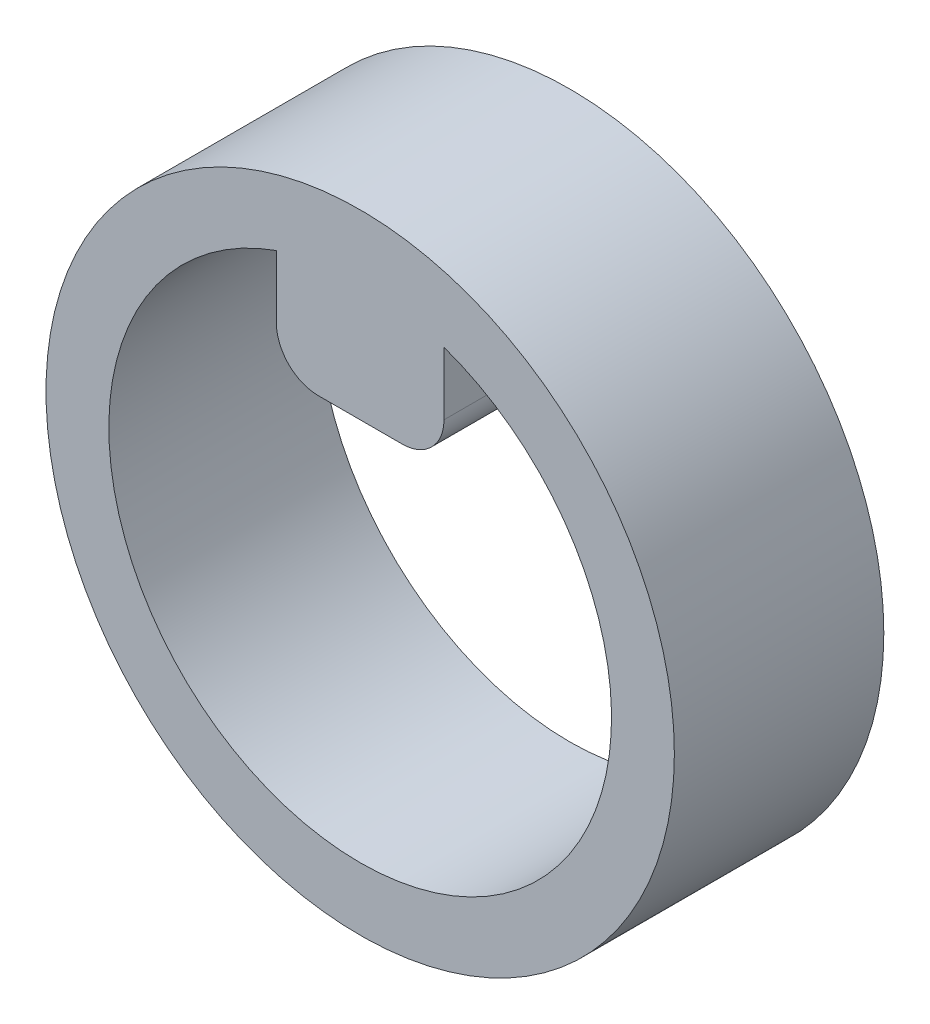
ISO-10303-21;
HEADER;
FILE_DESCRIPTION(('STEP AP214'),'2;1');
FILE_NAME('part.step','',(''),(''),'','','');
FILE_SCHEMA(('AUTOMOTIVE_DESIGN { 1 0 10303 214 1 1 1 1 }'));
ENDSEC;
DATA;
#1=APPLICATION_CONTEXT('core data for automotive mechanical design processes');
#2=APPLICATION_PROTOCOL_DEFINITION('international standard','automotive_design',2000,#1);
#3=PRODUCT_CONTEXT('',#1,'mechanical');
#4=PRODUCT('Part','Part','',(#3));
#5=PRODUCT_RELATED_PRODUCT_CATEGORY('part','',(#4));
#6=PRODUCT_DEFINITION_FORMATION('','',#4);
#7=PRODUCT_DEFINITION_CONTEXT('part definition',#1,'design');
#8=PRODUCT_DEFINITION('design','',#6,#7);
#9=PRODUCT_DEFINITION_SHAPE('','',#8);
#10=(LENGTH_UNIT() NAMED_UNIT(*) SI_UNIT(.MILLI.,.METRE.));
#11=(NAMED_UNIT(*) PLANE_ANGLE_UNIT() SI_UNIT($,.RADIAN.));
#12=(NAMED_UNIT(*) SI_UNIT($,.STERADIAN.) SOLID_ANGLE_UNIT());
#13=UNCERTAINTY_MEASURE_WITH_UNIT(LENGTH_MEASURE(1.E-05),#10,'distance_accuracy_value','');
#14=(GEOMETRIC_REPRESENTATION_CONTEXT(3) GLOBAL_UNCERTAINTY_ASSIGNED_CONTEXT((#13)) GLOBAL_UNIT_ASSIGNED_CONTEXT((#10,
#11,#12)) REPRESENTATION_CONTEXT('',''));
#15=CARTESIAN_POINT('',(0.,0.,0.));
#16=DIRECTION('',(0.,0.,1.));
#17=DIRECTION('',(1.,0.,0.));
#18=AXIS2_PLACEMENT_3D('',#15,#16,#17);
#19=CARTESIAN_POINT('',(0.,0.,5.));
#20=DIRECTION('',(0.,0.,1.));
#21=DIRECTION('',(1.,0.,0.));
#22=AXIS2_PLACEMENT_3D('',#19,#20,#21);
#23=PLANE('',#22);
#24=CARTESIAN_POINT('',(0.,0.,5.));
#25=DIRECTION('',(0.,0.,1.));
#26=DIRECTION('',(1.,0.,0.));
#27=AXIS2_PLACEMENT_3D('',#24,#25,#26);
#28=CIRCLE('',#27,7.5);
#29=CARTESIAN_POINT('',(7.5,0.,5.));
#30=VERTEX_POINT('',#29);
#31=EDGE_CURVE('E125',#30,#30,#28,.T.);
#32=ORIENTED_EDGE('',*,*,#31,.T.);
#33=EDGE_LOOP('',(#32));
#34=FACE_BOUND('',#33,.T.);
#35=DIRECTION('',(0.,1.,0.));
#36=VECTOR('',#35,1.);
#37=CARTESIAN_POINT('',(-2.,3.15685424949238,5.));
#38=LINE('',#37,#36);
#39=CARTESIAN_POINT('',(-2.,4.15685424949238,5.));
#40=VERTEX_POINT('',#39);
#41=CARTESIAN_POINT('',(-2.,5.65685424949238,5.));
#42=VERTEX_POINT('',#41);
#43=EDGE_CURVE('E91',#40,#42,#38,.T.);
#44=ORIENTED_EDGE('',*,*,#43,.F.);
#45=CARTESIAN_POINT('',(-1.,4.15685424949238,5.));
#46=DIRECTION('',(0.,0.,1.));
#47=DIRECTION('',(1.,0.,0.));
#48=AXIS2_PLACEMENT_3D('',#45,#46,#47);
#49=CIRCLE('',#48,1.);
#50=CARTESIAN_POINT('',(-1.,3.15685424949238,5.));
#51=VERTEX_POINT('',#50);
#52=EDGE_CURVE('E45',#40,#51,#49,.T.);
#53=ORIENTED_EDGE('',*,*,#52,.T.);
#54=DIRECTION('',(-1.,0.,0.));
#55=VECTOR('',#54,1.);
#56=CARTESIAN_POINT('',(-2.,3.15685424949238,5.));
#57=LINE('',#56,#55);
#58=CARTESIAN_POINT('',(1.,3.15685424949238,5.));
#59=VERTEX_POINT('',#58);
#60=EDGE_CURVE('E111',#59,#51,#57,.T.);
#61=ORIENTED_EDGE('',*,*,#60,.F.);
#62=CARTESIAN_POINT('',(1.,4.15685424949238,5.));
#63=DIRECTION('',(0.,0.,1.));
#64=DIRECTION('',(1.,0.,0.));
#65=AXIS2_PLACEMENT_3D('',#62,#63,#64);
#66=CIRCLE('',#65,1.);
#67=CARTESIAN_POINT('',(2.,4.15685424949238,5.));
#68=VERTEX_POINT('',#67);
#69=EDGE_CURVE('E52',#59,#68,#66,.T.);
#70=ORIENTED_EDGE('',*,*,#69,.T.);
#71=DIRECTION('',(0.,-1.,0.));
#72=VECTOR('',#71,1.);
#73=CARTESIAN_POINT('',(2.,3.15685424949238,5.));
#74=LINE('',#73,#72);
#75=CARTESIAN_POINT('',(2.,5.65685424949238,5.));
#76=VERTEX_POINT('',#75);
#77=EDGE_CURVE('E109',#76,#68,#74,.T.);
#78=ORIENTED_EDGE('',*,*,#77,.F.);
#79=CARTESIAN_POINT('',(0.,0.,5.));
#80=DIRECTION('',(0.,0.,1.));
#81=DIRECTION('',(1.,0.,0.));
#82=AXIS2_PLACEMENT_3D('',#79,#80,#81);
#83=CIRCLE('',#82,6.);
#84=EDGE_CURVE('E97',#42,#76,#83,.T.);
#85=ORIENTED_EDGE('',*,*,#84,.F.);
#86=EDGE_LOOP('',(#44,#53,#61,#70,#78,#85));
#87=FACE_BOUND('',#86,.T.);
#88=ADVANCED_FACE('F37',(#34,#87),#23,.T.);
#89=CARTESIAN_POINT('',(0.,0.,0.));
#90=DIRECTION('',(0.,0.,1.));
#91=DIRECTION('',(1.,0.,0.));
#92=AXIS2_PLACEMENT_3D('',#89,#90,#91);
#93=PLANE('',#92);
#94=CARTESIAN_POINT('',(0.,0.,0.));
#95=DIRECTION('',(0.,0.,1.));
#96=DIRECTION('',(1.,0.,0.));
#97=AXIS2_PLACEMENT_3D('',#94,#95,#96);
#98=CIRCLE('',#97,7.5);
#99=CARTESIAN_POINT('',(7.5,0.,0.));
#100=VERTEX_POINT('',#99);
#101=EDGE_CURVE('E106',#100,#100,#98,.T.);
#102=ORIENTED_EDGE('',*,*,#101,.F.);
#103=EDGE_LOOP('',(#102));
#104=FACE_BOUND('',#103,.T.);
#105=DIRECTION('',(-1.,0.,0.));
#106=VECTOR('',#105,1.);
#107=CARTESIAN_POINT('',(-2.,3.15685424949238,0.));
#108=LINE('',#107,#106);
#109=CARTESIAN_POINT('',(1.,3.15685424949238,0.));
#110=VERTEX_POINT('',#109);
#111=CARTESIAN_POINT('',(-1.,3.15685424949238,0.));
#112=VERTEX_POINT('',#111);
#113=EDGE_CURVE('E98',#110,#112,#108,.T.);
#114=ORIENTED_EDGE('',*,*,#113,.T.);
#115=CARTESIAN_POINT('',(-1.,4.15685424949238,0.));
#116=DIRECTION('',(0.,0.,1.));
#117=DIRECTION('',(1.,0.,0.));
#118=AXIS2_PLACEMENT_3D('',#115,#116,#117);
#119=CIRCLE('',#118,1.);
#120=CARTESIAN_POINT('',(-2.,4.15685424949238,0.));
#121=VERTEX_POINT('',#120);
#122=EDGE_CURVE('E137',#112,#121,#119,.F.);
#123=ORIENTED_EDGE('',*,*,#122,.T.);
#124=DIRECTION('',(0.,1.,0.));
#125=VECTOR('',#124,1.);
#126=CARTESIAN_POINT('',(-2.,3.15685424949238,0.));
#127=LINE('',#126,#125);
#128=CARTESIAN_POINT('',(-2.,5.65685424949238,0.));
#129=VERTEX_POINT('',#128);
#130=EDGE_CURVE('E116',#121,#129,#127,.T.);
#131=ORIENTED_EDGE('',*,*,#130,.T.);
#132=CARTESIAN_POINT('',(0.,0.,0.));
#133=DIRECTION('',(0.,0.,1.));
#134=DIRECTION('',(1.,0.,0.));
#135=AXIS2_PLACEMENT_3D('',#132,#133,#134);
#136=CIRCLE('',#135,6.);
#137=CARTESIAN_POINT('',(2.,5.65685424949238,0.));
#138=VERTEX_POINT('',#137);
#139=EDGE_CURVE('E105',#129,#138,#136,.T.);
#140=ORIENTED_EDGE('',*,*,#139,.T.);
#141=DIRECTION('',(0.,-1.,0.));
#142=VECTOR('',#141,1.);
#143=CARTESIAN_POINT('',(2.,3.15685424949238,0.));
#144=LINE('',#143,#142);
#145=CARTESIAN_POINT('',(2.,4.15685424949238,0.));
#146=VERTEX_POINT('',#145);
#147=EDGE_CURVE('E119',#138,#146,#144,.T.);
#148=ORIENTED_EDGE('',*,*,#147,.T.);
#149=CARTESIAN_POINT('',(1.,4.15685424949238,0.));
#150=DIRECTION('',(0.,0.,1.));
#151=DIRECTION('',(1.,0.,0.));
#152=AXIS2_PLACEMENT_3D('',#149,#150,#151);
#153=CIRCLE('',#152,1.);
#154=EDGE_CURVE('E135',#146,#110,#153,.F.);
#155=ORIENTED_EDGE('',*,*,#154,.T.);
#156=EDGE_LOOP('',(#114,#123,#131,#140,#148,#155));
#157=FACE_BOUND('',#156,.T.);
#158=ADVANCED_FACE('F148',(#104,#157),#93,.F.);
#159=CARTESIAN_POINT('',(0.,0.,5.));
#160=DIRECTION('',(0.,0.,-1.));
#161=DIRECTION('',(-1.,0.,0.));
#162=AXIS2_PLACEMENT_3D('',#159,#160,#161);
#163=CYLINDRICAL_SURFACE('',#162,7.5);
#164=ORIENTED_EDGE('',*,*,#31,.F.);
#165=EDGE_LOOP('',(#164));
#166=FACE_BOUND('',#165,.T.);
#167=ORIENTED_EDGE('',*,*,#101,.T.);
#168=EDGE_LOOP('',(#167));
#169=FACE_BOUND('',#168,.T.);
#170=ADVANCED_FACE('F168',(#166,#169),#163,.T.);
#171=CARTESIAN_POINT('',(-2.,3.15685424949238,5.));
#172=DIRECTION('',(-1.,0.,0.));
#173=DIRECTION('',(0.,-1.,0.));
#174=AXIS2_PLACEMENT_3D('',#171,#172,#173);
#175=PLANE('',#174);
#176=ORIENTED_EDGE('',*,*,#130,.F.);
#177=DIRECTION('',(0.,0.,-1.));
#178=VECTOR('',#177,1.);
#179=CARTESIAN_POINT('',(-2.,4.15685424949238,5.));
#180=LINE('',#179,#178);
#181=EDGE_CURVE('E60',#121,#40,#180,.F.);
#182=ORIENTED_EDGE('',*,*,#181,.T.);
#183=ORIENTED_EDGE('',*,*,#43,.T.);
#184=DIRECTION('',(0.,0.,-1.));
#185=VECTOR('',#184,1.);
#186=CARTESIAN_POINT('',(-2.,5.65685424949238,5.));
#187=LINE('',#186,#185);
#188=EDGE_CURVE('E94',#42,#129,#187,.T.);
#189=ORIENTED_EDGE('',*,*,#188,.T.);
#190=EDGE_LOOP('',(#176,#182,#183,#189));
#191=FACE_BOUND('',#190,.T.);
#192=ADVANCED_FACE('F93',(#191),#175,.T.);
#193=CARTESIAN_POINT('',(0.,0.,5.));
#194=DIRECTION('',(0.,0.,-1.));
#195=DIRECTION('',(-1.,0.,0.));
#196=AXIS2_PLACEMENT_3D('',#193,#194,#195);
#197=CYLINDRICAL_SURFACE('',#196,6.);
#198=ORIENTED_EDGE('',*,*,#139,.F.);
#199=ORIENTED_EDGE('',*,*,#188,.F.);
#200=ORIENTED_EDGE('',*,*,#84,.T.);
#201=DIRECTION('',(0.,0.,-1.));
#202=VECTOR('',#201,1.);
#203=CARTESIAN_POINT('',(2.,5.65685424949238,5.));
#204=LINE('',#203,#202);
#205=EDGE_CURVE('E107',#76,#138,#204,.T.);
#206=ORIENTED_EDGE('',*,*,#205,.T.);
#207=EDGE_LOOP('',(#198,#199,#200,#206));
#208=FACE_BOUND('',#207,.T.);
#209=ADVANCED_FACE('F102',(#208),#197,.F.);
#210=CARTESIAN_POINT('',(2.,3.15685424949238,5.));
#211=DIRECTION('',(1.,0.,0.));
#212=DIRECTION('',(0.,0.,-1.));
#213=AXIS2_PLACEMENT_3D('',#210,#211,#212);
#214=PLANE('',#213);
#215=ORIENTED_EDGE('',*,*,#77,.T.);
#216=DIRECTION('',(0.,0.,-1.));
#217=VECTOR('',#216,1.);
#218=CARTESIAN_POINT('',(2.,4.15685424949238,5.));
#219=LINE('',#218,#217);
#220=EDGE_CURVE('E11',#68,#146,#219,.T.);
#221=ORIENTED_EDGE('',*,*,#220,.T.);
#222=ORIENTED_EDGE('',*,*,#147,.F.);
#223=ORIENTED_EDGE('',*,*,#205,.F.);
#224=EDGE_LOOP('',(#215,#221,#222,#223));
#225=FACE_BOUND('',#224,.T.);
#226=ADVANCED_FACE('F153',(#225),#214,.T.);
#227=CARTESIAN_POINT('',(-2.,3.15685424949238,5.));
#228=DIRECTION('',(0.,-1.,0.));
#229=DIRECTION('',(0.,0.,-1.));
#230=AXIS2_PLACEMENT_3D('',#227,#228,#229);
#231=PLANE('',#230);
#232=ORIENTED_EDGE('',*,*,#60,.T.);
#233=DIRECTION('',(0.,0.,-1.));
#234=VECTOR('',#233,1.);
#235=CARTESIAN_POINT('',(-1.,3.15685424949238,5.));
#236=LINE('',#235,#234);
#237=EDGE_CURVE('E132',#51,#112,#236,.T.);
#238=ORIENTED_EDGE('',*,*,#237,.T.);
#239=ORIENTED_EDGE('',*,*,#113,.F.);
#240=DIRECTION('',(0.,0.,-1.));
#241=VECTOR('',#240,1.);
#242=CARTESIAN_POINT('',(1.,3.15685424949238,5.));
#243=LINE('',#242,#241);
#244=EDGE_CURVE('E128',#110,#59,#243,.F.);
#245=ORIENTED_EDGE('',*,*,#244,.T.);
#246=EDGE_LOOP('',(#232,#238,#239,#245));
#247=FACE_BOUND('',#246,.T.);
#248=ADVANCED_FACE('F143',(#247),#231,.T.);
#249=CARTESIAN_POINT('',(-1.,4.15685424949238,5.));
#250=DIRECTION('',(0.,0.,-1.));
#251=DIRECTION('',(-1.,0.,0.));
#252=AXIS2_PLACEMENT_3D('',#249,#250,#251);
#253=CYLINDRICAL_SURFACE('',#252,1.);
#254=ORIENTED_EDGE('',*,*,#52,.F.);
#255=ORIENTED_EDGE('',*,*,#181,.F.);
#256=ORIENTED_EDGE('',*,*,#122,.F.);
#257=ORIENTED_EDGE('',*,*,#237,.F.);
#258=EDGE_LOOP('',(#254,#255,#256,#257));
#259=FACE_BOUND('',#258,.T.);
#260=ADVANCED_FACE('F146',(#259),#253,.T.);
#261=CARTESIAN_POINT('',(1.,4.15685424949238,5.));
#262=DIRECTION('',(0.,0.,-1.));
#263=DIRECTION('',(-1.,0.,0.));
#264=AXIS2_PLACEMENT_3D('',#261,#262,#263);
#265=CYLINDRICAL_SURFACE('',#264,1.);
#266=ORIENTED_EDGE('',*,*,#69,.F.);
#267=ORIENTED_EDGE('',*,*,#244,.F.);
#268=ORIENTED_EDGE('',*,*,#154,.F.);
#269=ORIENTED_EDGE('',*,*,#220,.F.);
#270=EDGE_LOOP('',(#266,#267,#268,#269));
#271=FACE_BOUND('',#270,.T.);
#272=ADVANCED_FACE('F39',(#271),#265,.T.);
#273=CLOSED_SHELL('',(#88,#158,#170,#192,#209,#226,#248,#260,#272));
#274=MANIFOLD_SOLID_BREP('B2',#273);
#275=ADVANCED_BREP_SHAPE_REPRESENTATION('',(#18,#274),#14);
#276=SHAPE_DEFINITION_REPRESENTATION(#9,#275);
ENDSEC;
END-ISO-10303-21;
